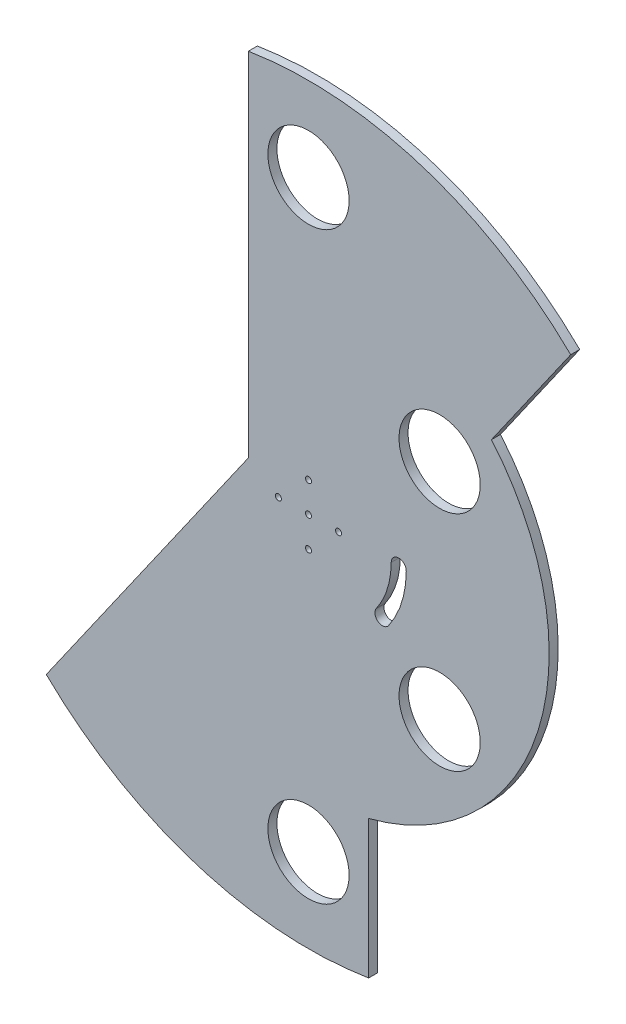
ISO-10303-21;
HEADER;
FILE_DESCRIPTION(('STEP AP214'),'2;1');
FILE_NAME('part.step','',(''),(''),'','','');
FILE_SCHEMA(('AUTOMOTIVE_DESIGN { 1 0 10303 214 1 1 1 1 }'));
ENDSEC;
DATA;
#1=APPLICATION_CONTEXT('core data for automotive mechanical design processes');
#2=APPLICATION_PROTOCOL_DEFINITION('international standard','automotive_design',2000,#1);
#3=PRODUCT_CONTEXT('',#1,'mechanical');
#4=PRODUCT('Part','Part','',(#3));
#5=PRODUCT_RELATED_PRODUCT_CATEGORY('part','',(#4));
#6=PRODUCT_DEFINITION_FORMATION('','',#4);
#7=PRODUCT_DEFINITION_CONTEXT('part definition',#1,'design');
#8=PRODUCT_DEFINITION('design','',#6,#7);
#9=PRODUCT_DEFINITION_SHAPE('','',#8);
#10=(LENGTH_UNIT() NAMED_UNIT(*) SI_UNIT(.MILLI.,.METRE.));
#11=(NAMED_UNIT(*) PLANE_ANGLE_UNIT() SI_UNIT($,.RADIAN.));
#12=(NAMED_UNIT(*) SI_UNIT($,.STERADIAN.) SOLID_ANGLE_UNIT());
#13=UNCERTAINTY_MEASURE_WITH_UNIT(LENGTH_MEASURE(1.E-05),#10,'distance_accuracy_value','');
#14=(GEOMETRIC_REPRESENTATION_CONTEXT(3) GLOBAL_UNCERTAINTY_ASSIGNED_CONTEXT((#13)) GLOBAL_UNIT_ASSIGNED_CONTEXT((#10,
#11,#12)) REPRESENTATION_CONTEXT('',''));
#15=CARTESIAN_POINT('',(0.,0.,0.));
#16=DIRECTION('',(0.,0.,1.));
#17=DIRECTION('',(1.,0.,0.));
#18=AXIS2_PLACEMENT_3D('',#15,#16,#17);
#19=CARTESIAN_POINT('',(0.,0.,0.));
#20=DIRECTION('',(0.,0.,1.));
#21=DIRECTION('',(1.,0.,0.));
#22=AXIS2_PLACEMENT_3D('',#19,#20,#21);
#23=PLANE('',#22);
#24=CARTESIAN_POINT('',(0.,-10.,0.));
#25=DIRECTION('',(0.,0.,1.));
#26=DIRECTION('',(1.,0.,0.));
#27=AXIS2_PLACEMENT_3D('',#24,#25,#26);
#28=CIRCLE('',#27,1.);
#29=CARTESIAN_POINT('',(1.,-10.,0.));
#30=VERTEX_POINT('',#29);
#31=EDGE_CURVE('E458',#30,#30,#28,.F.);
#32=ORIENTED_EDGE('',*,*,#31,.F.);
#33=EDGE_LOOP('',(#32));
#34=FACE_BOUND('',#33,.T.);
#35=CARTESIAN_POINT('',(10.,0.,0.));
#36=DIRECTION('',(0.,0.,1.));
#37=DIRECTION('',(1.,0.,0.));
#38=AXIS2_PLACEMENT_3D('',#35,#36,#37);
#39=CIRCLE('',#38,0.999999999999999);
#40=CARTESIAN_POINT('',(11.,0.,0.));
#41=VERTEX_POINT('',#40);
#42=EDGE_CURVE('E466',#41,#41,#39,.F.);
#43=ORIENTED_EDGE('',*,*,#42,.F.);
#44=EDGE_LOOP('',(#43));
#45=FACE_BOUND('',#44,.T.);
#46=CARTESIAN_POINT('',(0.,10.,0.));
#47=DIRECTION('',(0.,0.,1.));
#48=DIRECTION('',(1.,0.,0.));
#49=AXIS2_PLACEMENT_3D('',#46,#47,#48);
#50=CIRCLE('',#49,1.);
#51=CARTESIAN_POINT('',(1.,10.,0.));
#52=VERTEX_POINT('',#51);
#53=EDGE_CURVE('E472',#52,#52,#50,.F.);
#54=ORIENTED_EDGE('',*,*,#53,.F.);
#55=EDGE_LOOP('',(#54));
#56=FACE_BOUND('',#55,.T.);
#57=CARTESIAN_POINT('',(0.,-6.50868248186498E-12,0.));
#58=DIRECTION('',(0.,0.,1.));
#59=DIRECTION('',(1.,0.,0.));
#60=AXIS2_PLACEMENT_3D('',#57,#58,#59);
#61=CIRCLE('',#60,1.);
#62=CARTESIAN_POINT('',(1.00000000000001,-6.50868248186498E-12,0.));
#63=VERTEX_POINT('',#62);
#64=EDGE_CURVE('E478',#63,#63,#61,.F.);
#65=ORIENTED_EDGE('',*,*,#64,.F.);
#66=EDGE_LOOP('',(#65));
#67=FACE_BOUND('',#66,.T.);
#68=DIRECTION('',(0.,1.,0.));
#69=VECTOR('',#68,1.);
#70=CARTESIAN_POINT('',(-20.,0.,0.));
#71=LINE('',#70,#69);
#72=CARTESIAN_POINT('',(-20.,6.3059757775796,0.));
#73=VERTEX_POINT('',#72);
#74=CARTESIAN_POINT('',(-20.,123.389626792531,0.));
#75=VERTEX_POINT('',#74);
#76=EDGE_CURVE('E165',#73,#75,#71,.T.);
#77=ORIENTED_EDGE('',*,*,#76,.T.);
#78=CARTESIAN_POINT('',(0.,2.08166817117217E-13,0.));
#79=DIRECTION('',(0.,0.,1.));
#80=DIRECTION('',(1.,0.,0.));
#81=AXIS2_PLACEMENT_3D('',#78,#79,#80);
#82=CIRCLE('',#81,125.);
#83=CARTESIAN_POINT('',(87.1564233041253,89.6033363041362,0.));
#84=VERTEX_POINT('',#83);
#85=EDGE_CURVE('E182',#75,#84,#82,.F.);
#86=ORIENTED_EDGE('',*,*,#85,.T.);
#87=DIRECTION('',(0.573576436351047,0.819152044288991,0.));
#88=VECTOR('',#87,1.);
#89=CARTESIAN_POINT('',(16.3830408857798,-11.4715287270209,0.));
#90=LINE('',#89,#88);
#91=CARTESIAN_POINT('',(60.8120806010719,51.9797157838395,0.));
#92=VERTEX_POINT('',#91);
#93=EDGE_CURVE('E179',#92,#84,#90,.T.);
#94=ORIENTED_EDGE('',*,*,#93,.F.);
#95=CARTESIAN_POINT('',(-1.17961196366423E-13,0.,0.));
#96=DIRECTION('',(0.,0.,1.));
#97=DIRECTION('',(1.,0.,0.));
#98=AXIS2_PLACEMENT_3D('',#95,#96,#97);
#99=CIRCLE('',#98,80.0000000000001);
#100=CARTESIAN_POINT('',(20.,-77.4596669241483,0.));
#101=VERTEX_POINT('',#100);
#102=EDGE_CURVE('E177',#101,#92,#99,.T.);
#103=ORIENTED_EDGE('',*,*,#102,.F.);
#104=DIRECTION('',(0.,-1.,0.));
#105=VECTOR('',#104,1.);
#106=CARTESIAN_POINT('',(20.,0.,0.));
#107=LINE('',#106,#105);
#108=CARTESIAN_POINT('',(20.,-123.389626792531,0.));
#109=VERTEX_POINT('',#108);
#110=EDGE_CURVE('E174',#101,#109,#107,.T.);
#111=ORIENTED_EDGE('',*,*,#110,.T.);
#112=CARTESIAN_POINT('',(0.,2.35922392732846E-13,0.));
#113=DIRECTION('',(0.,0.,1.));
#114=DIRECTION('',(1.,0.,0.));
#115=AXIS2_PLACEMENT_3D('',#112,#113,#114);
#116=CIRCLE('',#115,125.);
#117=CARTESIAN_POINT('',(-87.1564233041246,-89.6033363041369,0.));
#118=VERTEX_POINT('',#117);
#119=EDGE_CURVE('E171',#118,#109,#116,.T.);
#120=ORIENTED_EDGE('',*,*,#119,.F.);
#121=DIRECTION('',(-0.573576436351041,-0.819152044288995,0.));
#122=VECTOR('',#121,1.);
#123=CARTESIAN_POINT('',(-16.3830408857799,11.4715287270208,0.));
#124=LINE('',#123,#122);
#125=EDGE_CURVE('E168',#73,#118,#124,.T.);
#126=ORIENTED_EDGE('',*,*,#125,.F.);
#127=EDGE_LOOP('',(#77,#86,#94,#103,#111,#120,#126));
#128=FACE_BOUND('',#127,.T.);
#129=CARTESIAN_POINT('',(29.9999999999999,0.,0.));
#130=DIRECTION('',(0.,0.,1.));
#131=DIRECTION('',(1.,0.,0.));
#132=AXIS2_PLACEMENT_3D('',#129,#130,#131);
#133=CIRCLE('',#132,2.50000000000001);
#134=CARTESIAN_POINT('',(32.5,0.,0.));
#135=VERTEX_POINT('',#134);
#136=CARTESIAN_POINT('',(27.5,0.,0.));
#137=VERTEX_POINT('',#136);
#138=EDGE_CURVE('E185',#135,#137,#133,.T.);
#139=ORIENTED_EDGE('',*,*,#138,.T.);
#140=CARTESIAN_POINT('',(-1.17961196366423E-13,0.,0.));
#141=DIRECTION('',(0.,0.,1.));
#142=DIRECTION('',(1.,0.,0.));
#143=AXIS2_PLACEMENT_3D('',#140,#141,#142);
#144=CIRCLE('',#143,27.5000000000001);
#145=CARTESIAN_POINT('',(22.5266812179475,-15.7733519996535,0.));
#146=VERTEX_POINT('',#145);
#147=EDGE_CURVE('E191',#146,#137,#144,.T.);
#148=ORIENTED_EDGE('',*,*,#147,.F.);
#149=CARTESIAN_POINT('',(24.57456132867,-17.2072930905311,0.));
#150=DIRECTION('',(0.,0.,1.));
#151=DIRECTION('',(1.,0.,0.));
#152=AXIS2_PLACEMENT_3D('',#149,#150,#151);
#153=CIRCLE('',#152,2.5);
#154=CARTESIAN_POINT('',(26.6224414393925,-18.6412341814086,0.));
#155=VERTEX_POINT('',#154);
#156=EDGE_CURVE('E189',#146,#155,#153,.T.);
#157=ORIENTED_EDGE('',*,*,#156,.T.);
#158=CARTESIAN_POINT('',(-1.17961196366423E-13,0.,0.));
#159=DIRECTION('',(0.,0.,1.));
#160=DIRECTION('',(1.,0.,0.));
#161=AXIS2_PLACEMENT_3D('',#158,#159,#160);
#162=CIRCLE('',#161,32.5000000000001);
#163=EDGE_CURVE('E136',#155,#135,#162,.T.);
#164=ORIENTED_EDGE('',*,*,#163,.T.);
#165=EDGE_LOOP('',(#139,#148,#157,#164));
#166=FACE_BOUND('',#165,.T.);
#167=CARTESIAN_POINT('',(0.,97.0820393249893,0.));
#168=DIRECTION('',(0.,0.,1.));
#169=DIRECTION('',(1.,0.,0.));
#170=AXIS2_PLACEMENT_3D('',#167,#168,#169);
#171=CIRCLE('',#170,13.500000000013);
#172=CARTESIAN_POINT('',(13.500000000013,97.0820393249893,0.));
#173=VERTEX_POINT('',#172);
#174=EDGE_CURVE('E193',#173,#173,#171,.T.);
#175=ORIENTED_EDGE('',*,*,#174,.T.);
#176=EDGE_LOOP('',(#175));
#177=FACE_BOUND('',#176,.T.);
#178=CARTESIAN_POINT('',(0.,-97.0820393249893,0.));
#179=DIRECTION('',(0.,0.,1.));
#180=DIRECTION('',(1.,0.,0.));
#181=AXIS2_PLACEMENT_3D('',#178,#179,#180);
#182=CIRCLE('',#181,13.5);
#183=CARTESIAN_POINT('',(13.5,-97.0820393249893,0.));
#184=VERTEX_POINT('',#183);
#185=EDGE_CURVE('E196',#184,#184,#182,.T.);
#186=ORIENTED_EDGE('',*,*,#185,.T.);
#187=EDGE_LOOP('',(#186));
#188=FACE_BOUND('',#187,.T.);
#189=CARTESIAN_POINT('',(43.5925516803342,37.0820393249921,0.));
#190=DIRECTION('',(0.,0.,1.));
#191=DIRECTION('',(1.,0.,0.));
#192=AXIS2_PLACEMENT_3D('',#189,#190,#191);
#193=CIRCLE('',#192,13.4999999999912);
#194=CARTESIAN_POINT('',(57.0925516803254,37.0820393249921,0.));
#195=VERTEX_POINT('',#194);
#196=EDGE_CURVE('E199',#195,#195,#193,.T.);
#197=ORIENTED_EDGE('',*,*,#196,.T.);
#198=EDGE_LOOP('',(#197));
#199=FACE_BOUND('',#198,.T.);
#200=CARTESIAN_POINT('',(43.5925516803257,-37.0820393250022,0.));
#201=DIRECTION('',(0.,0.,1.));
#202=DIRECTION('',(1.,0.,0.));
#203=AXIS2_PLACEMENT_3D('',#200,#201,#202);
#204=CIRCLE('',#203,13.5);
#205=CARTESIAN_POINT('',(57.0925516803257,-37.0820393250022,0.));
#206=VERTEX_POINT('',#205);
#207=EDGE_CURVE('E202',#206,#206,#204,.T.);
#208=ORIENTED_EDGE('',*,*,#207,.T.);
#209=EDGE_LOOP('',(#208));
#210=FACE_BOUND('',#209,.T.);
#211=CARTESIAN_POINT('',(-10.,0.,0.));
#212=DIRECTION('',(0.,0.,1.));
#213=DIRECTION('',(1.,0.,0.));
#214=AXIS2_PLACEMENT_3D('',#211,#212,#213);
#215=CIRCLE('',#214,0.999999999999999);
#216=CARTESIAN_POINT('',(-9.,0.,0.));
#217=VERTEX_POINT('',#216);
#218=EDGE_CURVE('E169',#217,#217,#215,.F.);
#219=ORIENTED_EDGE('',*,*,#218,.F.);
#220=EDGE_LOOP('',(#219));
#221=FACE_BOUND('',#220,.T.);
#222=ADVANCED_FACE('F38',(#34,#45,#56,#67,#128,#166,#177,#188,#199,#210,#221),#23,.F.);
#223=CARTESIAN_POINT('',(29.9999999999999,0.,3.));
#224=DIRECTION('',(0.,0.,-1.));
#225=DIRECTION('',(-1.,0.,0.));
#226=AXIS2_PLACEMENT_3D('',#223,#224,#225);
#227=CYLINDRICAL_SURFACE('',#226,2.50000000000001);
#228=ORIENTED_EDGE('',*,*,#138,.F.);
#229=DIRECTION('',(0.,0.,-1.));
#230=VECTOR('',#229,1.);
#231=CARTESIAN_POINT('',(32.5,0.,3.));
#232=LINE('',#231,#230);
#233=CARTESIAN_POINT('',(32.5,0.,3.));
#234=VERTEX_POINT('',#233);
#235=EDGE_CURVE('E11',#234,#135,#232,.T.);
#236=ORIENTED_EDGE('',*,*,#235,.F.);
#237=CARTESIAN_POINT('',(29.9999999999999,0.,3.));
#238=DIRECTION('',(0.,0.,1.));
#239=DIRECTION('',(1.,0.,0.));
#240=AXIS2_PLACEMENT_3D('',#237,#238,#239);
#241=CIRCLE('',#240,2.50000000000001);
#242=CARTESIAN_POINT('',(27.5,0.,3.));
#243=VERTEX_POINT('',#242);
#244=EDGE_CURVE('E145',#234,#243,#241,.T.);
#245=ORIENTED_EDGE('',*,*,#244,.T.);
#246=DIRECTION('',(0.,0.,-1.));
#247=VECTOR('',#246,1.);
#248=CARTESIAN_POINT('',(27.5,0.,3.));
#249=LINE('',#248,#247);
#250=EDGE_CURVE('E100',#243,#137,#249,.T.);
#251=ORIENTED_EDGE('',*,*,#250,.T.);
#252=EDGE_LOOP('',(#228,#236,#245,#251));
#253=FACE_BOUND('',#252,.T.);
#254=ADVANCED_FACE('F264',(#253),#227,.F.);
#255=CARTESIAN_POINT('',(-1.17961196366423E-13,0.,3.));
#256=DIRECTION('',(0.,0.,-1.));
#257=DIRECTION('',(-1.,0.,0.));
#258=AXIS2_PLACEMENT_3D('',#255,#256,#257);
#259=CYLINDRICAL_SURFACE('',#258,32.5000000000001);
#260=ORIENTED_EDGE('',*,*,#163,.F.);
#261=DIRECTION('',(0.,0.,-1.));
#262=VECTOR('',#261,1.);
#263=CARTESIAN_POINT('',(26.6224414393925,-18.6412341814086,3.));
#264=LINE('',#263,#262);
#265=CARTESIAN_POINT('',(26.6224414393925,-18.6412341814086,3.));
#266=VERTEX_POINT('',#265);
#267=EDGE_CURVE('E48',#266,#155,#264,.T.);
#268=ORIENTED_EDGE('',*,*,#267,.F.);
#269=CARTESIAN_POINT('',(-1.17961196366423E-13,0.,3.));
#270=DIRECTION('',(0.,0.,1.));
#271=DIRECTION('',(1.,0.,0.));
#272=AXIS2_PLACEMENT_3D('',#269,#270,#271);
#273=CIRCLE('',#272,32.5000000000001);
#274=EDGE_CURVE('E134',#266,#234,#273,.T.);
#275=ORIENTED_EDGE('',*,*,#274,.T.);
#276=ORIENTED_EDGE('',*,*,#235,.T.);
#277=EDGE_LOOP('',(#260,#268,#275,#276));
#278=FACE_BOUND('',#277,.T.);
#279=ADVANCED_FACE('F133',(#278),#259,.F.);
#280=CARTESIAN_POINT('',(24.57456132867,-17.2072930905311,3.));
#281=DIRECTION('',(0.,0.,-1.));
#282=DIRECTION('',(-1.,0.,0.));
#283=AXIS2_PLACEMENT_3D('',#280,#281,#282);
#284=CYLINDRICAL_SURFACE('',#283,2.5);
#285=ORIENTED_EDGE('',*,*,#156,.F.);
#286=DIRECTION('',(0.,0.,-1.));
#287=VECTOR('',#286,1.);
#288=CARTESIAN_POINT('',(22.5266812179475,-15.7733519996535,3.));
#289=LINE('',#288,#287);
#290=CARTESIAN_POINT('',(22.5266812179475,-15.7733519996535,3.));
#291=VERTEX_POINT('',#290);
#292=EDGE_CURVE('E93',#291,#146,#289,.T.);
#293=ORIENTED_EDGE('',*,*,#292,.F.);
#294=CARTESIAN_POINT('',(24.57456132867,-17.2072930905311,3.));
#295=DIRECTION('',(0.,0.,1.));
#296=DIRECTION('',(1.,0.,0.));
#297=AXIS2_PLACEMENT_3D('',#294,#295,#296);
#298=CIRCLE('',#297,2.5);
#299=EDGE_CURVE('E144',#291,#266,#298,.T.);
#300=ORIENTED_EDGE('',*,*,#299,.T.);
#301=ORIENTED_EDGE('',*,*,#267,.T.);
#302=EDGE_LOOP('',(#285,#293,#300,#301));
#303=FACE_BOUND('',#302,.T.);
#304=ADVANCED_FACE('F147',(#303),#284,.F.);
#305=CARTESIAN_POINT('',(-20.,0.,3.));
#306=DIRECTION('',(-1.,0.,0.));
#307=DIRECTION('',(0.,0.,1.));
#308=AXIS2_PLACEMENT_3D('',#305,#306,#307);
#309=PLANE('',#308);
#310=ORIENTED_EDGE('',*,*,#76,.F.);
#311=DIRECTION('',(0.,0.,-1.));
#312=VECTOR('',#311,1.);
#313=CARTESIAN_POINT('',(-20.,6.3059757775796,3.));
#314=LINE('',#313,#312);
#315=CARTESIAN_POINT('',(-20.,6.3059757775796,3.));
#316=VERTEX_POINT('',#315);
#317=EDGE_CURVE('E42',#316,#73,#314,.T.);
#318=ORIENTED_EDGE('',*,*,#317,.F.);
#319=DIRECTION('',(0.,1.,0.));
#320=VECTOR('',#319,1.);
#321=CARTESIAN_POINT('',(-20.,0.,3.));
#322=LINE('',#321,#320);
#323=CARTESIAN_POINT('',(-20.,123.389626792531,3.));
#324=VERTEX_POINT('',#323);
#325=EDGE_CURVE('E205',#316,#324,#322,.T.);
#326=ORIENTED_EDGE('',*,*,#325,.T.);
#327=DIRECTION('',(0.,0.,-1.));
#328=VECTOR('',#327,1.);
#329=CARTESIAN_POINT('',(-20.,123.389626792531,3.));
#330=LINE('',#329,#328);
#331=EDGE_CURVE('E164',#324,#75,#330,.T.);
#332=ORIENTED_EDGE('',*,*,#331,.T.);
#333=EDGE_LOOP('',(#310,#318,#326,#332));
#334=FACE_BOUND('',#333,.T.);
#335=ADVANCED_FACE('F40',(#334),#309,.T.);
#336=CARTESIAN_POINT('',(-16.3830408857799,11.4715287270208,3.));
#337=DIRECTION('',(0.819152044288995,-0.573576436351041,0.));
#338=DIRECTION('',(0.573576436351041,0.819152044288995,0.));
#339=AXIS2_PLACEMENT_3D('',#336,#337,#338);
#340=PLANE('',#339);
#341=ORIENTED_EDGE('',*,*,#125,.T.);
#342=DIRECTION('',(0.,0.,-1.));
#343=VECTOR('',#342,1.);
#344=CARTESIAN_POINT('',(-87.1564233041246,-89.6033363041369,3.));
#345=LINE('',#344,#343);
#346=CARTESIAN_POINT('',(-87.1564233041246,-89.6033363041369,3.));
#347=VERTEX_POINT('',#346);
#348=EDGE_CURVE('E217',#347,#118,#345,.T.);
#349=ORIENTED_EDGE('',*,*,#348,.F.);
#350=DIRECTION('',(-0.573576436351041,-0.819152044288995,0.));
#351=VECTOR('',#350,1.);
#352=CARTESIAN_POINT('',(-16.3830408857799,11.4715287270208,3.));
#353=LINE('',#352,#351);
#354=EDGE_CURVE('E226',#316,#347,#353,.T.);
#355=ORIENTED_EDGE('',*,*,#354,.F.);
#356=ORIENTED_EDGE('',*,*,#317,.T.);
#357=EDGE_LOOP('',(#341,#349,#355,#356));
#358=FACE_BOUND('',#357,.T.);
#359=ADVANCED_FACE('F225',(#358),#340,.F.);
#360=CARTESIAN_POINT('',(0.,2.35922392732846E-13,3.));
#361=DIRECTION('',(0.,0.,-1.));
#362=DIRECTION('',(-1.,0.,0.));
#363=AXIS2_PLACEMENT_3D('',#360,#361,#362);
#364=CYLINDRICAL_SURFACE('',#363,125.);
#365=ORIENTED_EDGE('',*,*,#119,.T.);
#366=DIRECTION('',(0.,0.,-1.));
#367=VECTOR('',#366,1.);
#368=CARTESIAN_POINT('',(20.,-123.389626792531,3.));
#369=LINE('',#368,#367);
#370=CARTESIAN_POINT('',(20.,-123.389626792531,3.));
#371=VERTEX_POINT('',#370);
#372=EDGE_CURVE('E216',#371,#109,#369,.T.);
#373=ORIENTED_EDGE('',*,*,#372,.F.);
#374=CARTESIAN_POINT('',(0.,2.35922392732846E-13,3.));
#375=DIRECTION('',(0.,0.,1.));
#376=DIRECTION('',(1.,0.,0.));
#377=AXIS2_PLACEMENT_3D('',#374,#375,#376);
#378=CIRCLE('',#377,125.);
#379=EDGE_CURVE('E490',#347,#371,#378,.T.);
#380=ORIENTED_EDGE('',*,*,#379,.F.);
#381=ORIENTED_EDGE('',*,*,#348,.T.);
#382=EDGE_LOOP('',(#365,#373,#380,#381));
#383=FACE_BOUND('',#382,.T.);
#384=ADVANCED_FACE('F255',(#383),#364,.T.);
#385=CARTESIAN_POINT('',(20.,0.,3.));
#386=DIRECTION('',(1.,0.,0.));
#387=DIRECTION('',(0.,1.,0.));
#388=AXIS2_PLACEMENT_3D('',#385,#386,#387);
#389=PLANE('',#388);
#390=ORIENTED_EDGE('',*,*,#110,.F.);
#391=DIRECTION('',(0.,0.,-1.));
#392=VECTOR('',#391,1.);
#393=CARTESIAN_POINT('',(20.,-77.4596669241483,3.));
#394=LINE('',#393,#392);
#395=CARTESIAN_POINT('',(20.,-77.4596669241483,3.));
#396=VERTEX_POINT('',#395);
#397=EDGE_CURVE('E214',#396,#101,#394,.T.);
#398=ORIENTED_EDGE('',*,*,#397,.F.);
#399=DIRECTION('',(0.,-1.,0.));
#400=VECTOR('',#399,1.);
#401=CARTESIAN_POINT('',(20.,0.,3.));
#402=LINE('',#401,#400);
#403=EDGE_CURVE('E253',#396,#371,#402,.T.);
#404=ORIENTED_EDGE('',*,*,#403,.T.);
#405=ORIENTED_EDGE('',*,*,#372,.T.);
#406=EDGE_LOOP('',(#390,#398,#404,#405));
#407=FACE_BOUND('',#406,.T.);
#408=ADVANCED_FACE('F252',(#407),#389,.T.);
#409=CARTESIAN_POINT('',(-1.17961196366423E-13,0.,3.));
#410=DIRECTION('',(0.,0.,-1.));
#411=DIRECTION('',(-1.,0.,0.));
#412=AXIS2_PLACEMENT_3D('',#409,#410,#411);
#413=CYLINDRICAL_SURFACE('',#412,80.0000000000001);
#414=ORIENTED_EDGE('',*,*,#102,.T.);
#415=DIRECTION('',(0.,0.,-1.));
#416=VECTOR('',#415,1.);
#417=CARTESIAN_POINT('',(60.8120806010719,51.9797157838395,3.));
#418=LINE('',#417,#416);
#419=CARTESIAN_POINT('',(60.8120806010719,51.9797157838395,3.));
#420=VERTEX_POINT('',#419);
#421=EDGE_CURVE('E211',#420,#92,#418,.T.);
#422=ORIENTED_EDGE('',*,*,#421,.F.);
#423=CARTESIAN_POINT('',(-1.17961196366423E-13,0.,3.));
#424=DIRECTION('',(0.,0.,1.));
#425=DIRECTION('',(1.,0.,0.));
#426=AXIS2_PLACEMENT_3D('',#423,#424,#425);
#427=CIRCLE('',#426,80.0000000000001);
#428=EDGE_CURVE('E248',#396,#420,#427,.T.);
#429=ORIENTED_EDGE('',*,*,#428,.F.);
#430=ORIENTED_EDGE('',*,*,#397,.T.);
#431=EDGE_LOOP('',(#414,#422,#429,#430));
#432=FACE_BOUND('',#431,.T.);
#433=ADVANCED_FACE('F247',(#432),#413,.T.);
#434=CARTESIAN_POINT('',(16.3830408857798,-11.4715287270209,3.));
#435=DIRECTION('',(-0.819152044288991,0.573576436351047,0.));
#436=DIRECTION('',(-0.573576436351047,-0.819152044288991,0.));
#437=AXIS2_PLACEMENT_3D('',#434,#435,#436);
#438=PLANE('',#437);
#439=ORIENTED_EDGE('',*,*,#93,.T.);
#440=DIRECTION('',(0.,0.,-1.));
#441=VECTOR('',#440,1.);
#442=CARTESIAN_POINT('',(87.1564233041253,89.6033363041362,3.));
#443=LINE('',#442,#441);
#444=CARTESIAN_POINT('',(87.1564233041253,89.6033363041362,3.));
#445=VERTEX_POINT('',#444);
#446=EDGE_CURVE('E209',#445,#84,#443,.T.);
#447=ORIENTED_EDGE('',*,*,#446,.F.);
#448=DIRECTION('',(0.573576436351047,0.819152044288991,0.));
#449=VECTOR('',#448,1.);
#450=CARTESIAN_POINT('',(16.3830408857798,-11.4715287270209,3.));
#451=LINE('',#450,#449);
#452=EDGE_CURVE('E244',#420,#445,#451,.T.);
#453=ORIENTED_EDGE('',*,*,#452,.F.);
#454=ORIENTED_EDGE('',*,*,#421,.T.);
#455=EDGE_LOOP('',(#439,#447,#453,#454));
#456=FACE_BOUND('',#455,.T.);
#457=ADVANCED_FACE('F241',(#456),#438,.F.);
#458=CARTESIAN_POINT('',(43.5925516803342,37.0820393249921,3.));
#459=DIRECTION('',(0.,0.,-1.));
#460=DIRECTION('',(-1.,0.,0.));
#461=AXIS2_PLACEMENT_3D('',#458,#459,#460);
#462=CYLINDRICAL_SURFACE('',#461,13.4999999999912);
#463=CARTESIAN_POINT('',(43.5925516803342,37.0820393249921,3.));
#464=DIRECTION('',(0.,0.,1.));
#465=DIRECTION('',(1.,0.,0.));
#466=AXIS2_PLACEMENT_3D('',#463,#464,#465);
#467=CIRCLE('',#466,13.4999999999912);
#468=CARTESIAN_POINT('',(57.0925516803254,37.0820393249921,3.));
#469=VERTEX_POINT('',#468);
#470=EDGE_CURVE('E158',#469,#469,#467,.T.);
#471=ORIENTED_EDGE('',*,*,#470,.T.);
#472=EDGE_LOOP('',(#471));
#473=FACE_BOUND('',#472,.T.);
#474=ORIENTED_EDGE('',*,*,#196,.F.);
#475=EDGE_LOOP('',(#474));
#476=FACE_BOUND('',#475,.T.);
#477=ADVANCED_FACE('F280',(#473,#476),#462,.F.);
#478=CARTESIAN_POINT('',(0.,-97.0820393249893,3.));
#479=DIRECTION('',(0.,0.,-1.));
#480=DIRECTION('',(-1.,0.,0.));
#481=AXIS2_PLACEMENT_3D('',#478,#479,#480);
#482=CYLINDRICAL_SURFACE('',#481,13.5);
#483=CARTESIAN_POINT('',(0.,-97.0820393249893,3.));
#484=DIRECTION('',(0.,0.,1.));
#485=DIRECTION('',(1.,0.,0.));
#486=AXIS2_PLACEMENT_3D('',#483,#484,#485);
#487=CIRCLE('',#486,13.5);
#488=CARTESIAN_POINT('',(13.5,-97.0820393249893,3.));
#489=VERTEX_POINT('',#488);
#490=EDGE_CURVE('E155',#489,#489,#487,.T.);
#491=ORIENTED_EDGE('',*,*,#490,.T.);
#492=EDGE_LOOP('',(#491));
#493=FACE_BOUND('',#492,.T.);
#494=ORIENTED_EDGE('',*,*,#185,.F.);
#495=EDGE_LOOP('',(#494));
#496=FACE_BOUND('',#495,.T.);
#497=ADVANCED_FACE('F283',(#493,#496),#482,.F.);
#498=CARTESIAN_POINT('',(0.,97.0820393249893,3.));
#499=DIRECTION('',(0.,0.,-1.));
#500=DIRECTION('',(-1.,0.,0.));
#501=AXIS2_PLACEMENT_3D('',#498,#499,#500);
#502=CYLINDRICAL_SURFACE('',#501,13.500000000013);
#503=CARTESIAN_POINT('',(0.,97.0820393249893,3.));
#504=DIRECTION('',(0.,0.,1.));
#505=DIRECTION('',(1.,0.,0.));
#506=AXIS2_PLACEMENT_3D('',#503,#504,#505);
#507=CIRCLE('',#506,13.500000000013);
#508=CARTESIAN_POINT('',(13.500000000013,97.0820393249893,3.));
#509=VERTEX_POINT('',#508);
#510=EDGE_CURVE('E149',#509,#509,#507,.T.);
#511=ORIENTED_EDGE('',*,*,#510,.T.);
#512=EDGE_LOOP('',(#511));
#513=FACE_BOUND('',#512,.T.);
#514=ORIENTED_EDGE('',*,*,#174,.F.);
#515=EDGE_LOOP('',(#514));
#516=FACE_BOUND('',#515,.T.);
#517=ADVANCED_FACE('F287',(#513,#516),#502,.F.);
#518=CARTESIAN_POINT('',(-1.17961196366423E-13,0.,3.));
#519=DIRECTION('',(0.,0.,-1.));
#520=DIRECTION('',(-1.,0.,0.));
#521=AXIS2_PLACEMENT_3D('',#518,#519,#520);
#522=CYLINDRICAL_SURFACE('',#521,27.5000000000001);
#523=ORIENTED_EDGE('',*,*,#147,.T.);
#524=ORIENTED_EDGE('',*,*,#250,.F.);
#525=CARTESIAN_POINT('',(-1.17961196366423E-13,0.,3.));
#526=DIRECTION('',(0.,0.,1.));
#527=DIRECTION('',(1.,0.,0.));
#528=AXIS2_PLACEMENT_3D('',#525,#526,#527);
#529=CIRCLE('',#528,27.5000000000001);
#530=EDGE_CURVE('E57',#291,#243,#529,.T.);
#531=ORIENTED_EDGE('',*,*,#530,.F.);
#532=ORIENTED_EDGE('',*,*,#292,.T.);
#533=EDGE_LOOP('',(#523,#524,#531,#532));
#534=FACE_BOUND('',#533,.T.);
#535=ADVANCED_FACE('F291',(#534),#522,.T.);
#536=CARTESIAN_POINT('',(0.,2.08166817117217E-13,3.));
#537=DIRECTION('',(0.,0.,-1.));
#538=DIRECTION('',(-1.,0.,0.));
#539=AXIS2_PLACEMENT_3D('',#536,#537,#538);
#540=CYLINDRICAL_SURFACE('',#539,125.);
#541=ORIENTED_EDGE('',*,*,#85,.F.);
#542=ORIENTED_EDGE('',*,*,#331,.F.);
#543=CARTESIAN_POINT('',(0.,2.08166817117217E-13,3.));
#544=DIRECTION('',(0.,0.,1.));
#545=DIRECTION('',(1.,0.,0.));
#546=AXIS2_PLACEMENT_3D('',#543,#544,#545);
#547=CIRCLE('',#546,125.);
#548=EDGE_CURVE('E235',#324,#445,#547,.F.);
#549=ORIENTED_EDGE('',*,*,#548,.T.);
#550=ORIENTED_EDGE('',*,*,#446,.T.);
#551=EDGE_LOOP('',(#541,#542,#549,#550));
#552=FACE_BOUND('',#551,.T.);
#553=ADVANCED_FACE('F234',(#552),#540,.T.);
#554=CARTESIAN_POINT('',(43.5925516803257,-37.0820393250022,3.));
#555=DIRECTION('',(0.,0.,-1.));
#556=DIRECTION('',(-1.,0.,0.));
#557=AXIS2_PLACEMENT_3D('',#554,#555,#556);
#558=CYLINDRICAL_SURFACE('',#557,13.5);
#559=CARTESIAN_POINT('',(43.5925516803257,-37.0820393250022,3.));
#560=DIRECTION('',(0.,0.,1.));
#561=DIRECTION('',(1.,0.,0.));
#562=AXIS2_PLACEMENT_3D('',#559,#560,#561);
#563=CIRCLE('',#562,13.5);
#564=CARTESIAN_POINT('',(57.0925516803257,-37.0820393250022,3.));
#565=VERTEX_POINT('',#564);
#566=EDGE_CURVE('E161',#565,#565,#563,.T.);
#567=ORIENTED_EDGE('',*,*,#566,.T.);
#568=EDGE_LOOP('',(#567));
#569=FACE_BOUND('',#568,.T.);
#570=ORIENTED_EDGE('',*,*,#207,.F.);
#571=EDGE_LOOP('',(#570));
#572=FACE_BOUND('',#571,.T.);
#573=ADVANCED_FACE('F276',(#569,#572),#558,.F.);
#574=CARTESIAN_POINT('',(0.,0.,3.));
#575=DIRECTION('',(0.,0.,1.));
#576=DIRECTION('',(1.,0.,0.));
#577=AXIS2_PLACEMENT_3D('',#574,#575,#576);
#578=PLANE('',#577);
#579=CARTESIAN_POINT('',(0.,-10.,3.));
#580=DIRECTION('',(0.,0.,1.));
#581=DIRECTION('',(1.,0.,0.));
#582=AXIS2_PLACEMENT_3D('',#579,#580,#581);
#583=CIRCLE('',#582,1.);
#584=CARTESIAN_POINT('',(1.,-10.,3.));
#585=VERTEX_POINT('',#584);
#586=EDGE_CURVE('E461',#585,#585,#583,.T.);
#587=ORIENTED_EDGE('',*,*,#586,.F.);
#588=EDGE_LOOP('',(#587));
#589=FACE_BOUND('',#588,.T.);
#590=CARTESIAN_POINT('',(10.,0.,3.));
#591=DIRECTION('',(0.,0.,1.));
#592=DIRECTION('',(1.,0.,0.));
#593=AXIS2_PLACEMENT_3D('',#590,#591,#592);
#594=CIRCLE('',#593,0.999999999999999);
#595=CARTESIAN_POINT('',(11.,0.,3.));
#596=VERTEX_POINT('',#595);
#597=EDGE_CURVE('E463',#596,#596,#594,.T.);
#598=ORIENTED_EDGE('',*,*,#597,.F.);
#599=EDGE_LOOP('',(#598));
#600=FACE_BOUND('',#599,.T.);
#601=CARTESIAN_POINT('',(0.,10.,3.));
#602=DIRECTION('',(0.,0.,1.));
#603=DIRECTION('',(1.,0.,0.));
#604=AXIS2_PLACEMENT_3D('',#601,#602,#603);
#605=CIRCLE('',#604,1.);
#606=CARTESIAN_POINT('',(1.,10.,3.));
#607=VERTEX_POINT('',#606);
#608=EDGE_CURVE('E469',#607,#607,#605,.T.);
#609=ORIENTED_EDGE('',*,*,#608,.F.);
#610=EDGE_LOOP('',(#609));
#611=FACE_BOUND('',#610,.T.);
#612=CARTESIAN_POINT('',(0.,-6.50868248186498E-12,3.));
#613=DIRECTION('',(0.,0.,1.));
#614=DIRECTION('',(1.,0.,0.));
#615=AXIS2_PLACEMENT_3D('',#612,#613,#614);
#616=CIRCLE('',#615,1.);
#617=CARTESIAN_POINT('',(1.00000000000001,-6.50868248186498E-12,3.));
#618=VERTEX_POINT('',#617);
#619=EDGE_CURVE('E475',#618,#618,#616,.T.);
#620=ORIENTED_EDGE('',*,*,#619,.F.);
#621=EDGE_LOOP('',(#620));
#622=FACE_BOUND('',#621,.T.);
#623=CARTESIAN_POINT('',(-10.,0.,3.));
#624=DIRECTION('',(0.,0.,1.));
#625=DIRECTION('',(1.,0.,0.));
#626=AXIS2_PLACEMENT_3D('',#623,#624,#625);
#627=CIRCLE('',#626,0.999999999999999);
#628=CARTESIAN_POINT('',(-9.,0.,3.));
#629=VERTEX_POINT('',#628);
#630=EDGE_CURVE('E481',#629,#629,#627,.T.);
#631=ORIENTED_EDGE('',*,*,#630,.F.);
#632=EDGE_LOOP('',(#631));
#633=FACE_BOUND('',#632,.T.);
#634=ORIENTED_EDGE('',*,*,#325,.F.);
#635=ORIENTED_EDGE('',*,*,#354,.T.);
#636=ORIENTED_EDGE('',*,*,#379,.T.);
#637=ORIENTED_EDGE('',*,*,#403,.F.);
#638=ORIENTED_EDGE('',*,*,#428,.T.);
#639=ORIENTED_EDGE('',*,*,#452,.T.);
#640=ORIENTED_EDGE('',*,*,#548,.F.);
#641=EDGE_LOOP('',(#634,#635,#636,#637,#638,#639,#640));
#642=FACE_BOUND('',#641,.T.);
#643=ORIENTED_EDGE('',*,*,#244,.F.);
#644=ORIENTED_EDGE('',*,*,#274,.F.);
#645=ORIENTED_EDGE('',*,*,#299,.F.);
#646=ORIENTED_EDGE('',*,*,#530,.T.);
#647=EDGE_LOOP('',(#643,#644,#645,#646));
#648=FACE_BOUND('',#647,.T.);
#649=ORIENTED_EDGE('',*,*,#510,.F.);
#650=EDGE_LOOP('',(#649));
#651=FACE_BOUND('',#650,.T.);
#652=ORIENTED_EDGE('',*,*,#490,.F.);
#653=EDGE_LOOP('',(#652));
#654=FACE_BOUND('',#653,.T.);
#655=ORIENTED_EDGE('',*,*,#470,.F.);
#656=EDGE_LOOP('',(#655));
#657=FACE_BOUND('',#656,.T.);
#658=ORIENTED_EDGE('',*,*,#566,.F.);
#659=EDGE_LOOP('',(#658));
#660=FACE_BOUND('',#659,.T.);
#661=ADVANCED_FACE('F142',(#589,#600,#611,#622,#633,#642,#648,#651,#654,#657,#660),#578,.T.);
#662=CARTESIAN_POINT('',(-10.,0.,3.));
#663=DIRECTION('',(0.,0.,1.));
#664=DIRECTION('',(1.,0.,0.));
#665=AXIS2_PLACEMENT_3D('',#662,#663,#664);
#666=CYLINDRICAL_SURFACE('',#665,0.999999999999999);
#667=ORIENTED_EDGE('',*,*,#218,.T.);
#668=EDGE_LOOP('',(#667));
#669=FACE_BOUND('',#668,.T.);
#670=ORIENTED_EDGE('',*,*,#630,.T.);
#671=EDGE_LOOP('',(#670));
#672=FACE_BOUND('',#671,.T.);
#673=ADVANCED_FACE('F342',(#669,#672),#666,.F.);
#674=CARTESIAN_POINT('',(0.,-6.50868248186498E-12,3.));
#675=DIRECTION('',(0.,0.,1.));
#676=DIRECTION('',(1.,0.,0.));
#677=AXIS2_PLACEMENT_3D('',#674,#675,#676);
#678=CYLINDRICAL_SURFACE('',#677,1.);
#679=ORIENTED_EDGE('',*,*,#64,.T.);
#680=EDGE_LOOP('',(#679));
#681=FACE_BOUND('',#680,.T.);
#682=ORIENTED_EDGE('',*,*,#619,.T.);
#683=EDGE_LOOP('',(#682));
#684=FACE_BOUND('',#683,.T.);
#685=ADVANCED_FACE('F349',(#681,#684),#678,.F.);
#686=CARTESIAN_POINT('',(0.,10.,3.));
#687=DIRECTION('',(0.,0.,1.));
#688=DIRECTION('',(1.,0.,0.));
#689=AXIS2_PLACEMENT_3D('',#686,#687,#688);
#690=CYLINDRICAL_SURFACE('',#689,1.);
#691=ORIENTED_EDGE('',*,*,#53,.T.);
#692=EDGE_LOOP('',(#691));
#693=FACE_BOUND('',#692,.T.);
#694=ORIENTED_EDGE('',*,*,#608,.T.);
#695=EDGE_LOOP('',(#694));
#696=FACE_BOUND('',#695,.T.);
#697=ADVANCED_FACE('F356',(#693,#696),#690,.F.);
#698=CARTESIAN_POINT('',(10.,0.,3.));
#699=DIRECTION('',(0.,0.,1.));
#700=DIRECTION('',(1.,0.,0.));
#701=AXIS2_PLACEMENT_3D('',#698,#699,#700);
#702=CYLINDRICAL_SURFACE('',#701,0.999999999999999);
#703=ORIENTED_EDGE('',*,*,#42,.T.);
#704=EDGE_LOOP('',(#703));
#705=FACE_BOUND('',#704,.T.);
#706=ORIENTED_EDGE('',*,*,#597,.T.);
#707=EDGE_LOOP('',(#706));
#708=FACE_BOUND('',#707,.T.);
#709=ADVANCED_FACE('F364',(#705,#708),#702,.F.);
#710=CARTESIAN_POINT('',(0.,-10.,3.));
#711=DIRECTION('',(0.,0.,1.));
#712=DIRECTION('',(1.,0.,0.));
#713=AXIS2_PLACEMENT_3D('',#710,#711,#712);
#714=CYLINDRICAL_SURFACE('',#713,1.);
#715=ORIENTED_EDGE('',*,*,#31,.T.);
#716=EDGE_LOOP('',(#715));
#717=FACE_BOUND('',#716,.T.);
#718=ORIENTED_EDGE('',*,*,#586,.T.);
#719=EDGE_LOOP('',(#718));
#720=FACE_BOUND('',#719,.T.);
#721=ADVANCED_FACE('F372',(#717,#720),#714,.F.);
#722=CLOSED_SHELL('',(#222,#254,#279,#304,#335,#359,#384,#408,#433,#457,#477,#497,#517,#535,
#553,#573,#661,#673,#685,#697,#709,#721));
#723=MANIFOLD_SOLID_BREP('B2',#722);
#724=ADVANCED_BREP_SHAPE_REPRESENTATION('',(#18,#723),#14);
#725=SHAPE_DEFINITION_REPRESENTATION(#9,#724);
ENDSEC;
END-ISO-10303-21;
